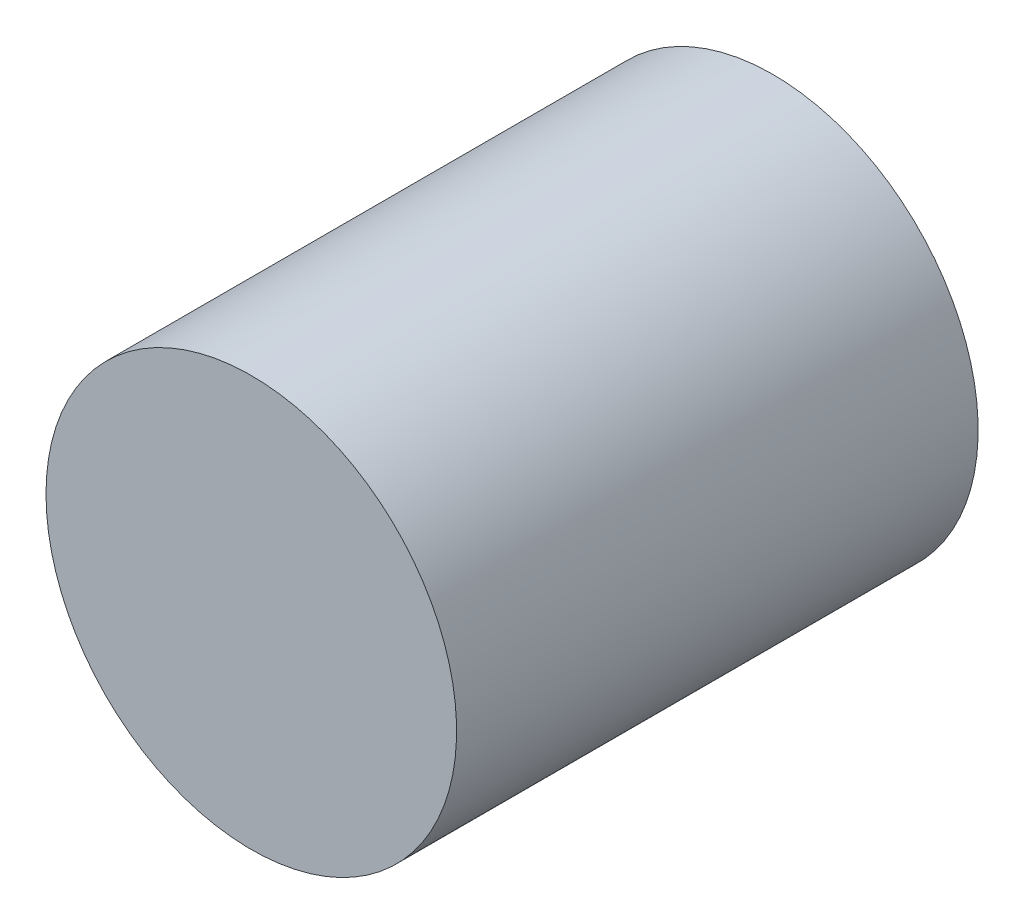
ISO-10303-21;
HEADER;
FILE_DESCRIPTION(('STEP AP214'),'2;1');
FILE_NAME('part.step','',(''),(''),'','','');
FILE_SCHEMA(('AUTOMOTIVE_DESIGN { 1 0 10303 214 1 1 1 1 }'));
ENDSEC;
DATA;
#1=APPLICATION_CONTEXT('core data for automotive mechanical design processes');
#2=APPLICATION_PROTOCOL_DEFINITION('international standard','automotive_design',2000,#1);
#3=PRODUCT_CONTEXT('',#1,'mechanical');
#4=PRODUCT('Part','Part','',(#3));
#5=PRODUCT_RELATED_PRODUCT_CATEGORY('part','',(#4));
#6=PRODUCT_DEFINITION_FORMATION('','',#4);
#7=PRODUCT_DEFINITION_CONTEXT('part definition',#1,'design');
#8=PRODUCT_DEFINITION('design','',#6,#7);
#9=PRODUCT_DEFINITION_SHAPE('','',#8);
#10=(LENGTH_UNIT() NAMED_UNIT(*) SI_UNIT(.MILLI.,.METRE.));
#11=(NAMED_UNIT(*) PLANE_ANGLE_UNIT() SI_UNIT($,.RADIAN.));
#12=(NAMED_UNIT(*) SI_UNIT($,.STERADIAN.) SOLID_ANGLE_UNIT());
#13=UNCERTAINTY_MEASURE_WITH_UNIT(LENGTH_MEASURE(1.E-05),#10,'distance_accuracy_value','');
#14=(GEOMETRIC_REPRESENTATION_CONTEXT(3) GLOBAL_UNCERTAINTY_ASSIGNED_CONTEXT((#13)) GLOBAL_UNIT_ASSIGNED_CONTEXT((#10,
#11,#12)) REPRESENTATION_CONTEXT('',''));
#15=CARTESIAN_POINT('',(0.,0.,0.));
#16=DIRECTION('',(0.,0.,1.));
#17=DIRECTION('',(1.,0.,0.));
#18=AXIS2_PLACEMENT_3D('',#15,#16,#17);
#19=CARTESIAN_POINT('',(0.,0.,-57.));
#20=DIRECTION('',(0.,0.,-1.));
#21=DIRECTION('',(-1.,0.,0.));
#22=AXIS2_PLACEMENT_3D('',#19,#20,#21);
#23=PLANE('',#22);
#24=CARTESIAN_POINT('',(-25.5219113985845,0.,-57.));
#25=DIRECTION('',(0.,0.,-1.));
#26=DIRECTION('',(-1.,0.,0.));
#27=AXIS2_PLACEMENT_3D('',#24,#25,#26);
#28=CIRCLE('',#27,21.2566947196087);
#29=CARTESIAN_POINT('',(-46.7786061181932,0.,-57.));
#30=VERTEX_POINT('',#29);
#31=EDGE_CURVE('E42',#30,#30,#28,.T.);
#32=ORIENTED_EDGE('',*,*,#31,.T.);
#33=EDGE_LOOP('',(#32));
#34=FACE_BOUND('',#33,.T.);
#35=ADVANCED_FACE('F39',(#34),#23,.T.);
#36=CARTESIAN_POINT('',(-25.5219113985845,0.,-3.));
#37=DIRECTION('',(0.,0.,-1.));
#38=DIRECTION('',(-1.,0.,0.));
#39=AXIS2_PLACEMENT_3D('',#36,#37,#38);
#40=CYLINDRICAL_SURFACE('',#39,21.2566947196087);
#41=CARTESIAN_POINT('',(-25.5219113985845,0.,-3.));
#42=DIRECTION('',(0.,0.,-1.));
#43=DIRECTION('',(-1.,0.,0.));
#44=AXIS2_PLACEMENT_3D('',#41,#42,#43);
#45=CIRCLE('',#44,21.2566947196087);
#46=CARTESIAN_POINT('',(-46.7786061181932,0.,-3.));
#47=VERTEX_POINT('',#46);
#48=EDGE_CURVE('E10',#47,#47,#45,.T.);
#49=ORIENTED_EDGE('',*,*,#48,.T.);
#50=EDGE_LOOP('',(#49));
#51=FACE_BOUND('',#50,.T.);
#52=ORIENTED_EDGE('',*,*,#31,.F.);
#53=EDGE_LOOP('',(#52));
#54=FACE_BOUND('',#53,.T.);
#55=ADVANCED_FACE('F58',(#51,#54),#40,.T.);
#56=CARTESIAN_POINT('',(-25.5219113985845,0.,-3.));
#57=DIRECTION('',(0.,0.,-1.));
#58=DIRECTION('',(-1.,0.,0.));
#59=AXIS2_PLACEMENT_3D('',#56,#57,#58);
#60=PLANE('',#59);
#61=ORIENTED_EDGE('',*,*,#48,.F.);
#62=EDGE_LOOP('',(#61));
#63=FACE_BOUND('',#62,.T.);
#64=ADVANCED_FACE('F60',(#63),#60,.F.);
#65=CLOSED_SHELL('',(#35,#55,#64));
#66=MANIFOLD_SOLID_BREP('B2',#65);
#67=ADVANCED_BREP_SHAPE_REPRESENTATION('',(#18,#66),#14);
#68=SHAPE_DEFINITION_REPRESENTATION(#9,#67);
ENDSEC;
END-ISO-10303-21;
